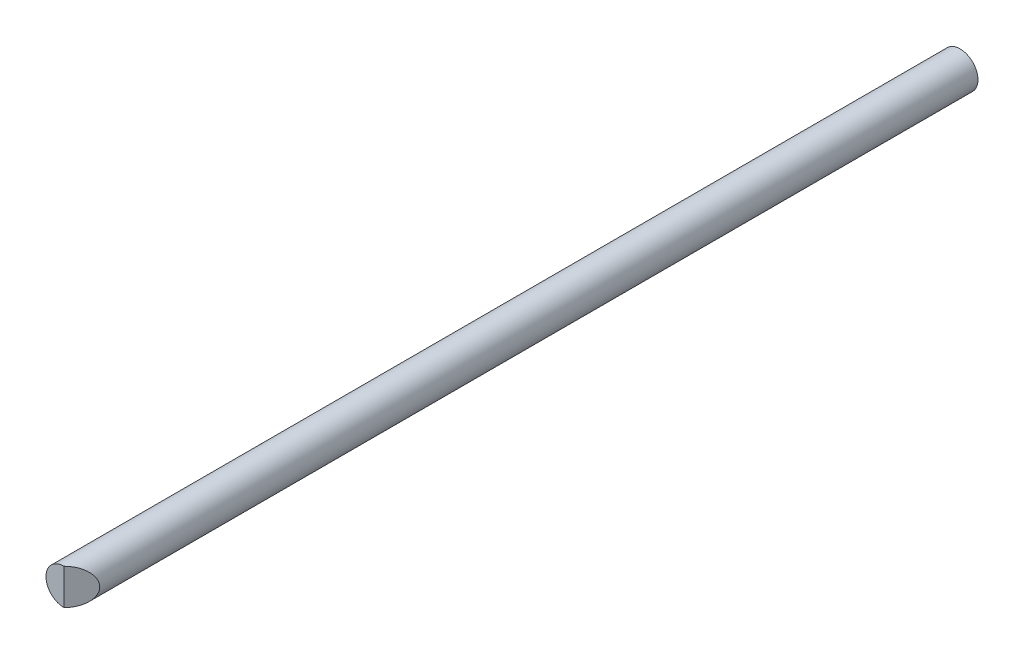
ISO-10303-21;
HEADER;
FILE_DESCRIPTION(('STEP AP214'),'2;1');
FILE_NAME('part.step','',(''),(''),'','','');
FILE_SCHEMA(('AUTOMOTIVE_DESIGN { 1 0 10303 214 1 1 1 1 }'));
ENDSEC;
DATA;
#1=APPLICATION_CONTEXT('core data for automotive mechanical design processes');
#2=APPLICATION_PROTOCOL_DEFINITION('international standard','automotive_design',2000,#1);
#3=PRODUCT_CONTEXT('',#1,'mechanical');
#4=PRODUCT('Part','Part','',(#3));
#5=PRODUCT_RELATED_PRODUCT_CATEGORY('part','',(#4));
#6=PRODUCT_DEFINITION_FORMATION('','',#4);
#7=PRODUCT_DEFINITION_CONTEXT('part definition',#1,'design');
#8=PRODUCT_DEFINITION('design','',#6,#7);
#9=PRODUCT_DEFINITION_SHAPE('','',#8);
#10=(LENGTH_UNIT() NAMED_UNIT(*) SI_UNIT(.MILLI.,.METRE.));
#11=(NAMED_UNIT(*) PLANE_ANGLE_UNIT() SI_UNIT($,.RADIAN.));
#12=(NAMED_UNIT(*) SI_UNIT($,.STERADIAN.) SOLID_ANGLE_UNIT());
#13=UNCERTAINTY_MEASURE_WITH_UNIT(LENGTH_MEASURE(1.E-05),#10,'distance_accuracy_value','');
#14=(GEOMETRIC_REPRESENTATION_CONTEXT(3) GLOBAL_UNCERTAINTY_ASSIGNED_CONTEXT((#13)) GLOBAL_UNIT_ASSIGNED_CONTEXT((#10,
#11,#12)) REPRESENTATION_CONTEXT('',''));
#15=CARTESIAN_POINT('',(0.,0.,0.));
#16=DIRECTION('',(0.,0.,1.));
#17=DIRECTION('',(1.,0.,0.));
#18=AXIS2_PLACEMENT_3D('',#15,#16,#17);
#19=CARTESIAN_POINT('',(0.,0.,25.));
#20=DIRECTION('',(0.,0.,-1.));
#21=DIRECTION('',(-1.,0.,0.));
#22=AXIS2_PLACEMENT_3D('',#19,#20,#21);
#23=CYLINDRICAL_SURFACE('',#22,0.5);
#24=CARTESIAN_POINT('',(0.,0.,25.));
#25=DIRECTION('',(-0.707106781186545,0.,-0.70710678118655));
#26=DIRECTION('',(0.70710678118655,0.,-0.707106781186545));
#27=AXIS2_PLACEMENT_3D('',#24,#25,#26);
#28=ELLIPSE('',#27,0.707106781186546,0.5);
#29=CARTESIAN_POINT('',(0.,0.5,25.));
#30=VERTEX_POINT('',#29);
#31=CARTESIAN_POINT('',(0.,-0.5,25.));
#32=VERTEX_POINT('',#31);
#33=EDGE_CURVE('E48',#30,#32,#28,.T.);
#34=ORIENTED_EDGE('',*,*,#33,.T.);
#35=CARTESIAN_POINT('',(0.,0.,25.));
#36=DIRECTION('',(0.,0.,1.));
#37=DIRECTION('',(1.,0.,0.));
#38=AXIS2_PLACEMENT_3D('',#35,#36,#37);
#39=CIRCLE('',#38,0.5);
#40=EDGE_CURVE('E43',#30,#32,#39,.T.);
#41=ORIENTED_EDGE('',*,*,#40,.F.);
#42=EDGE_LOOP('',(#34,#41));
#43=FACE_BOUND('',#42,.T.);
#44=CARTESIAN_POINT('',(0.,0.,0.));
#45=DIRECTION('',(0.,0.,1.));
#46=DIRECTION('',(1.,0.,0.));
#47=AXIS2_PLACEMENT_3D('',#44,#45,#46);
#48=CIRCLE('',#47,0.5);
#49=CARTESIAN_POINT('',(0.5,0.,0.));
#50=VERTEX_POINT('',#49);
#51=EDGE_CURVE('E54',#50,#50,#48,.T.);
#52=ORIENTED_EDGE('',*,*,#51,.T.);
#53=EDGE_LOOP('',(#52));
#54=FACE_BOUND('',#53,.T.);
#55=ADVANCED_FACE('F36',(#43,#54),#23,.T.);
#56=CARTESIAN_POINT('',(0.,0.,25.));
#57=DIRECTION('',(0.,0.,1.));
#58=DIRECTION('',(1.,0.,0.));
#59=AXIS2_PLACEMENT_3D('',#56,#57,#58);
#60=PLANE('',#59);
#61=DIRECTION('',(0.,-1.,0.));
#62=VECTOR('',#61,1.);
#63=CARTESIAN_POINT('',(0.,0.,25.));
#64=LINE('',#63,#62);
#65=EDGE_CURVE('E11',#30,#32,#64,.T.);
#66=ORIENTED_EDGE('',*,*,#65,.F.);
#67=ORIENTED_EDGE('',*,*,#40,.T.);
#68=EDGE_LOOP('',(#66,#67));
#69=FACE_BOUND('',#68,.T.);
#70=ADVANCED_FACE('F58',(#69),#60,.T.);
#71=CARTESIAN_POINT('',(0.,0.,0.));
#72=DIRECTION('',(0.,0.,1.));
#73=DIRECTION('',(1.,0.,0.));
#74=AXIS2_PLACEMENT_3D('',#71,#72,#73);
#75=PLANE('',#74);
#76=ORIENTED_EDGE('',*,*,#51,.F.);
#77=EDGE_LOOP('',(#76));
#78=FACE_BOUND('',#77,.T.);
#79=ADVANCED_FACE('F63',(#78),#75,.F.);
#80=CARTESIAN_POINT('',(0.,-12.5,25.));
#81=DIRECTION('',(-0.707106781186545,0.,-0.70710678118655));
#82=DIRECTION('',(-0.70710678118655,0.,0.707106781186545));
#83=AXIS2_PLACEMENT_3D('',#80,#81,#82);
#84=PLANE('',#83);
#85=ORIENTED_EDGE('',*,*,#33,.F.);
#86=ORIENTED_EDGE('',*,*,#65,.T.);
#87=EDGE_LOOP('',(#85,#86));
#88=FACE_BOUND('',#87,.T.);
#89=ADVANCED_FACE('F56',(#88),#84,.F.);
#90=CLOSED_SHELL('',(#55,#70,#79,#89));
#91=MANIFOLD_SOLID_BREP('B2',#90);
#92=ADVANCED_BREP_SHAPE_REPRESENTATION('',(#18,#91),#14);
#93=SHAPE_DEFINITION_REPRESENTATION(#9,#92);
ENDSEC;
END-ISO-10303-21;
